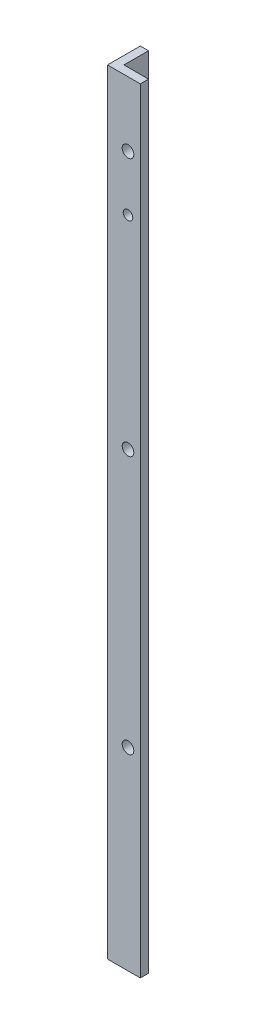
ISO-10303-21;
HEADER;
FILE_DESCRIPTION(('STEP AP214'),'2;1');
FILE_NAME('part.step','',(''),(''),'','','');
FILE_SCHEMA(('AUTOMOTIVE_DESIGN { 1 0 10303 214 1 1 1 1 }'));
ENDSEC;
DATA;
#1=APPLICATION_CONTEXT('core data for automotive mechanical design processes');
#2=APPLICATION_PROTOCOL_DEFINITION('international standard','automotive_design',2000,#1);
#3=PRODUCT_CONTEXT('',#1,'mechanical');
#4=PRODUCT('Part','Part','',(#3));
#5=PRODUCT_RELATED_PRODUCT_CATEGORY('part','',(#4));
#6=PRODUCT_DEFINITION_FORMATION('','',#4);
#7=PRODUCT_DEFINITION_CONTEXT('part definition',#1,'design');
#8=PRODUCT_DEFINITION('design','',#6,#7);
#9=PRODUCT_DEFINITION_SHAPE('','',#8);
#10=(LENGTH_UNIT() NAMED_UNIT(*) SI_UNIT(.MILLI.,.METRE.));
#11=(NAMED_UNIT(*) PLANE_ANGLE_UNIT() SI_UNIT($,.RADIAN.));
#12=(NAMED_UNIT(*) SI_UNIT($,.STERADIAN.) SOLID_ANGLE_UNIT());
#13=UNCERTAINTY_MEASURE_WITH_UNIT(LENGTH_MEASURE(1.E-05),#10,'distance_accuracy_value','');
#14=(GEOMETRIC_REPRESENTATION_CONTEXT(3) GLOBAL_UNCERTAINTY_ASSIGNED_CONTEXT((#13)) GLOBAL_UNIT_ASSIGNED_CONTEXT((#10,
#11,#12)) REPRESENTATION_CONTEXT('',''));
#15=CARTESIAN_POINT('',(0.,0.,0.));
#16=DIRECTION('',(0.,0.,1.));
#17=DIRECTION('',(1.,0.,0.));
#18=AXIS2_PLACEMENT_3D('',#15,#16,#17);
#19=CARTESIAN_POINT('',(0.,300.,0.));
#20=DIRECTION('',(1.,0.,0.));
#21=DIRECTION('',(0.,0.,-1.));
#22=AXIS2_PLACEMENT_3D('',#19,#20,#21);
#23=PLANE('',#22);
#24=CARTESIAN_POINT('',(0.,225.,-7.94000000000001));
#25=DIRECTION('',(1.,0.,0.));
#26=DIRECTION('',(0.,0.,-1.));
#27=AXIS2_PLACEMENT_3D('',#24,#25,#26);
#28=CIRCLE('',#27,2.25);
#29=CARTESIAN_POINT('',(0.,225.,-10.19));
#30=VERTEX_POINT('',#29);
#31=EDGE_CURVE('E175',#30,#30,#28,.T.);
#32=ORIENTED_EDGE('',*,*,#31,.T.);
#33=EDGE_LOOP('',(#32));
#34=FACE_BOUND('',#33,.T.);
#35=CARTESIAN_POINT('',(0.,125.,-7.94000000000001));
#36=DIRECTION('',(1.,0.,0.));
#37=DIRECTION('',(0.,0.,-1.));
#38=AXIS2_PLACEMENT_3D('',#35,#36,#37);
#39=CIRCLE('',#38,2.25);
#40=CARTESIAN_POINT('',(0.,125.,-10.19));
#41=VERTEX_POINT('',#40);
#42=EDGE_CURVE('E179',#41,#41,#39,.T.);
#43=ORIENTED_EDGE('',*,*,#42,.T.);
#44=EDGE_LOOP('',(#43));
#45=FACE_BOUND('',#44,.T.);
#46=CARTESIAN_POINT('',(0.,25.,-7.94000000000001));
#47=DIRECTION('',(1.,0.,0.));
#48=DIRECTION('',(0.,0.,-1.));
#49=AXIS2_PLACEMENT_3D('',#46,#47,#48);
#50=CIRCLE('',#49,2.25);
#51=CARTESIAN_POINT('',(0.,25.,-10.19));
#52=VERTEX_POINT('',#51);
#53=EDGE_CURVE('E182',#52,#52,#50,.T.);
#54=ORIENTED_EDGE('',*,*,#53,.T.);
#55=EDGE_LOOP('',(#54));
#56=FACE_BOUND('',#55,.T.);
#57=DIRECTION('',(0.,0.,1.));
#58=VECTOR('',#57,1.);
#59=CARTESIAN_POINT('',(0.,0.,0.));
#60=LINE('',#59,#58);
#61=CARTESIAN_POINT('',(0.,0.,-12.7));
#62=VERTEX_POINT('',#61);
#63=CARTESIAN_POINT('',(0.,0.,0.));
#64=VERTEX_POINT('',#63);
#65=EDGE_CURVE('E129',#62,#64,#60,.T.);
#66=ORIENTED_EDGE('',*,*,#65,.T.);
#67=DIRECTION('',(0.,-1.,0.));
#68=VECTOR('',#67,1.);
#69=CARTESIAN_POINT('',(0.,300.,0.));
#70=LINE('',#69,#68);
#71=CARTESIAN_POINT('',(0.,300.,0.));
#72=VERTEX_POINT('',#71);
#73=EDGE_CURVE('E11',#72,#64,#70,.T.);
#74=ORIENTED_EDGE('',*,*,#73,.F.);
#75=DIRECTION('',(0.,0.,1.));
#76=VECTOR('',#75,1.);
#77=CARTESIAN_POINT('',(0.,300.,0.));
#78=LINE('',#77,#76);
#79=CARTESIAN_POINT('',(0.,300.,-12.7));
#80=VERTEX_POINT('',#79);
#81=EDGE_CURVE('E140',#80,#72,#78,.T.);
#82=ORIENTED_EDGE('',*,*,#81,.F.);
#83=DIRECTION('',(0.,-1.,0.));
#84=VECTOR('',#83,1.);
#85=CARTESIAN_POINT('',(0.,300.,-12.7));
#86=LINE('',#85,#84);
#87=EDGE_CURVE('E125',#80,#62,#86,.T.);
#88=ORIENTED_EDGE('',*,*,#87,.T.);
#89=EDGE_LOOP('',(#66,#74,#82,#88));
#90=FACE_BOUND('',#89,.T.);
#91=ADVANCED_FACE('F44',(#34,#45,#56,#90),#23,.F.);
#92=CARTESIAN_POINT('',(0.,300.,0.));
#93=DIRECTION('',(0.,0.,-1.));
#94=DIRECTION('',(-1.,0.,0.));
#95=AXIS2_PLACEMENT_3D('',#92,#93,#94);
#96=PLANE('',#95);
#97=CARTESIAN_POINT('',(7.93999999999999,253.6,0.));
#98=DIRECTION('',(0.,0.,1.));
#99=DIRECTION('',(1.,0.,0.));
#100=AXIS2_PLACEMENT_3D('',#97,#98,#99);
#101=CIRCLE('',#100,1.85);
#102=CARTESIAN_POINT('',(9.78999999999999,253.6,0.));
#103=VERTEX_POINT('',#102);
#104=EDGE_CURVE('E370',#103,#103,#101,.T.);
#105=ORIENTED_EDGE('',*,*,#104,.F.);
#106=EDGE_LOOP('',(#105));
#107=FACE_BOUND('',#106,.T.);
#108=CARTESIAN_POINT('',(7.94,275.,0.));
#109=DIRECTION('',(0.,0.,-1.));
#110=DIRECTION('',(-1.,0.,0.));
#111=AXIS2_PLACEMENT_3D('',#108,#109,#110);
#112=CIRCLE('',#111,2.25);
#113=CARTESIAN_POINT('',(5.68999999999999,275.,0.));
#114=VERTEX_POINT('',#113);
#115=EDGE_CURVE('E133',#114,#114,#112,.T.);
#116=ORIENTED_EDGE('',*,*,#115,.T.);
#117=EDGE_LOOP('',(#116));
#118=FACE_BOUND('',#117,.T.);
#119=CARTESIAN_POINT('',(7.94,175.,0.));
#120=DIRECTION('',(0.,0.,-1.));
#121=DIRECTION('',(-1.,0.,0.));
#122=AXIS2_PLACEMENT_3D('',#119,#120,#121);
#123=CIRCLE('',#122,2.25);
#124=CARTESIAN_POINT('',(5.68999999999999,175.,0.));
#125=VERTEX_POINT('',#124);
#126=EDGE_CURVE('E207',#125,#125,#123,.T.);
#127=ORIENTED_EDGE('',*,*,#126,.T.);
#128=EDGE_LOOP('',(#127));
#129=FACE_BOUND('',#128,.T.);
#130=CARTESIAN_POINT('',(7.94,75.,0.));
#131=DIRECTION('',(0.,0.,-1.));
#132=DIRECTION('',(-1.,0.,0.));
#133=AXIS2_PLACEMENT_3D('',#130,#131,#132);
#134=CIRCLE('',#133,2.25);
#135=CARTESIAN_POINT('',(5.68999999999999,75.,0.));
#136=VERTEX_POINT('',#135);
#137=EDGE_CURVE('E199',#136,#136,#134,.T.);
#138=ORIENTED_EDGE('',*,*,#137,.T.);
#139=EDGE_LOOP('',(#138));
#140=FACE_BOUND('',#139,.T.);
#141=DIRECTION('',(1.,0.,0.));
#142=VECTOR('',#141,1.);
#143=CARTESIAN_POINT('',(0.,0.,0.));
#144=LINE('',#143,#142);
#145=CARTESIAN_POINT('',(12.7,0.,0.));
#146=VERTEX_POINT('',#145);
#147=EDGE_CURVE('E132',#64,#146,#144,.T.);
#148=ORIENTED_EDGE('',*,*,#147,.T.);
#149=DIRECTION('',(0.,-1.,0.));
#150=VECTOR('',#149,1.);
#151=CARTESIAN_POINT('',(12.7,300.,0.));
#152=LINE('',#151,#150);
#153=CARTESIAN_POINT('',(12.7,300.,0.));
#154=VERTEX_POINT('',#153);
#155=EDGE_CURVE('E53',#154,#146,#152,.T.);
#156=ORIENTED_EDGE('',*,*,#155,.F.);
#157=DIRECTION('',(1.,0.,0.));
#158=VECTOR('',#157,1.);
#159=CARTESIAN_POINT('',(0.,300.,0.));
#160=LINE('',#159,#158);
#161=EDGE_CURVE('E98',#72,#154,#160,.T.);
#162=ORIENTED_EDGE('',*,*,#161,.F.);
#163=ORIENTED_EDGE('',*,*,#73,.T.);
#164=EDGE_LOOP('',(#148,#156,#162,#163));
#165=FACE_BOUND('',#164,.T.);
#166=ADVANCED_FACE('F166',(#107,#118,#129,#140,#165),#96,.F.);
#167=CARTESIAN_POINT('',(12.7,300.,0.));
#168=DIRECTION('',(-1.,0.,0.));
#169=DIRECTION('',(0.,0.,1.));
#170=AXIS2_PLACEMENT_3D('',#167,#168,#169);
#171=PLANE('',#170);
#172=DIRECTION('',(0.,0.,-1.));
#173=VECTOR('',#172,1.);
#174=CARTESIAN_POINT('',(12.7,0.,0.));
#175=LINE('',#174,#173);
#176=CARTESIAN_POINT('',(12.7,0.,-3.18));
#177=VERTEX_POINT('',#176);
#178=EDGE_CURVE('E135',#146,#177,#175,.T.);
#179=ORIENTED_EDGE('',*,*,#178,.T.);
#180=DIRECTION('',(0.,-1.,0.));
#181=VECTOR('',#180,1.);
#182=CARTESIAN_POINT('',(12.7,300.,-3.18));
#183=LINE('',#182,#181);
#184=CARTESIAN_POINT('',(12.7,300.,-3.18));
#185=VERTEX_POINT('',#184);
#186=EDGE_CURVE('E120',#185,#177,#183,.T.);
#187=ORIENTED_EDGE('',*,*,#186,.F.);
#188=DIRECTION('',(0.,0.,-1.));
#189=VECTOR('',#188,1.);
#190=CARTESIAN_POINT('',(12.7,300.,0.));
#191=LINE('',#190,#189);
#192=EDGE_CURVE('E111',#154,#185,#191,.T.);
#193=ORIENTED_EDGE('',*,*,#192,.F.);
#194=ORIENTED_EDGE('',*,*,#155,.T.);
#195=EDGE_LOOP('',(#179,#187,#193,#194));
#196=FACE_BOUND('',#195,.T.);
#197=ADVANCED_FACE('F147',(#196),#171,.F.);
#198=CARTESIAN_POINT('',(3.18,300.,-3.18));
#199=DIRECTION('',(0.,0.,1.));
#200=DIRECTION('',(1.,0.,0.));
#201=AXIS2_PLACEMENT_3D('',#198,#199,#200);
#202=PLANE('',#201);
#203=CARTESIAN_POINT('',(7.93999999999999,253.6,-3.18));
#204=DIRECTION('',(0.,0.,1.));
#205=DIRECTION('',(1.,0.,0.));
#206=AXIS2_PLACEMENT_3D('',#203,#204,#205);
#207=CIRCLE('',#206,1.85);
#208=CARTESIAN_POINT('',(9.78999999999999,253.6,-3.18));
#209=VERTEX_POINT('',#208);
#210=EDGE_CURVE('E47',#209,#209,#207,.T.);
#211=ORIENTED_EDGE('',*,*,#210,.T.);
#212=EDGE_LOOP('',(#211));
#213=FACE_BOUND('',#212,.T.);
#214=CARTESIAN_POINT('',(7.94,275.,-3.18));
#215=DIRECTION('',(0.,0.,-1.));
#216=DIRECTION('',(-1.,0.,0.));
#217=AXIS2_PLACEMENT_3D('',#214,#215,#216);
#218=CIRCLE('',#217,2.25);
#219=CARTESIAN_POINT('',(5.68999999999999,275.,-3.18));
#220=VERTEX_POINT('',#219);
#221=EDGE_CURVE('E196',#220,#220,#218,.T.);
#222=ORIENTED_EDGE('',*,*,#221,.F.);
#223=EDGE_LOOP('',(#222));
#224=FACE_BOUND('',#223,.T.);
#225=CARTESIAN_POINT('',(7.94,175.,-3.18));
#226=DIRECTION('',(0.,0.,-1.));
#227=DIRECTION('',(-1.,0.,0.));
#228=AXIS2_PLACEMENT_3D('',#225,#226,#227);
#229=CIRCLE('',#228,2.25);
#230=CARTESIAN_POINT('',(5.68999999999999,175.,-3.18));
#231=VERTEX_POINT('',#230);
#232=EDGE_CURVE('E200',#231,#231,#229,.T.);
#233=ORIENTED_EDGE('',*,*,#232,.F.);
#234=EDGE_LOOP('',(#233));
#235=FACE_BOUND('',#234,.T.);
#236=CARTESIAN_POINT('',(7.94,75.,-3.18));
#237=DIRECTION('',(0.,0.,-1.));
#238=DIRECTION('',(-1.,0.,0.));
#239=AXIS2_PLACEMENT_3D('',#236,#237,#238);
#240=CIRCLE('',#239,2.25);
#241=CARTESIAN_POINT('',(5.68999999999999,75.,-3.18));
#242=VERTEX_POINT('',#241);
#243=EDGE_CURVE('E195',#242,#242,#240,.T.);
#244=ORIENTED_EDGE('',*,*,#243,.F.);
#245=EDGE_LOOP('',(#244));
#246=FACE_BOUND('',#245,.T.);
#247=DIRECTION('',(-1.,0.,0.));
#248=VECTOR('',#247,1.);
#249=CARTESIAN_POINT('',(3.18,0.,-3.18));
#250=LINE('',#249,#248);
#251=CARTESIAN_POINT('',(3.18,0.,-3.18));
#252=VERTEX_POINT('',#251);
#253=EDGE_CURVE('E119',#177,#252,#250,.T.);
#254=ORIENTED_EDGE('',*,*,#253,.T.);
#255=DIRECTION('',(0.,-1.,0.));
#256=VECTOR('',#255,1.);
#257=CARTESIAN_POINT('',(3.18,300.,-3.18));
#258=LINE('',#257,#256);
#259=CARTESIAN_POINT('',(3.18,300.,-3.18));
#260=VERTEX_POINT('',#259);
#261=EDGE_CURVE('E116',#260,#252,#258,.T.);
#262=ORIENTED_EDGE('',*,*,#261,.F.);
#263=DIRECTION('',(-1.,0.,0.));
#264=VECTOR('',#263,1.);
#265=CARTESIAN_POINT('',(3.18,300.,-3.18));
#266=LINE('',#265,#264);
#267=EDGE_CURVE('E105',#185,#260,#266,.T.);
#268=ORIENTED_EDGE('',*,*,#267,.F.);
#269=ORIENTED_EDGE('',*,*,#186,.T.);
#270=EDGE_LOOP('',(#254,#262,#268,#269));
#271=FACE_BOUND('',#270,.T.);
#272=ADVANCED_FACE('F117',(#213,#224,#235,#246,#271),#202,.F.);
#273=CARTESIAN_POINT('',(3.18,300.,-3.18));
#274=DIRECTION('',(-1.,0.,0.));
#275=DIRECTION('',(0.,0.,1.));
#276=AXIS2_PLACEMENT_3D('',#273,#274,#275);
#277=PLANE('',#276);
#278=CARTESIAN_POINT('',(3.18,225.,-7.94000000000001));
#279=DIRECTION('',(1.,0.,0.));
#280=DIRECTION('',(0.,0.,-1.));
#281=AXIS2_PLACEMENT_3D('',#278,#279,#280);
#282=CIRCLE('',#281,2.25);
#283=CARTESIAN_POINT('',(3.18,225.,-10.19));
#284=VERTEX_POINT('',#283);
#285=EDGE_CURVE('E184',#284,#284,#282,.T.);
#286=ORIENTED_EDGE('',*,*,#285,.F.);
#287=EDGE_LOOP('',(#286));
#288=FACE_BOUND('',#287,.T.);
#289=CARTESIAN_POINT('',(3.18,125.,-7.94000000000001));
#290=DIRECTION('',(1.,0.,0.));
#291=DIRECTION('',(0.,0.,-1.));
#292=AXIS2_PLACEMENT_3D('',#289,#290,#291);
#293=CIRCLE('',#292,2.25);
#294=CARTESIAN_POINT('',(3.18,125.,-10.19));
#295=VERTEX_POINT('',#294);
#296=EDGE_CURVE('E188',#295,#295,#293,.T.);
#297=ORIENTED_EDGE('',*,*,#296,.F.);
#298=EDGE_LOOP('',(#297));
#299=FACE_BOUND('',#298,.T.);
#300=CARTESIAN_POINT('',(3.18,25.,-7.94000000000001));
#301=DIRECTION('',(1.,0.,0.));
#302=DIRECTION('',(0.,0.,-1.));
#303=AXIS2_PLACEMENT_3D('',#300,#301,#302);
#304=CIRCLE('',#303,2.25);
#305=CARTESIAN_POINT('',(3.18,25.,-10.19));
#306=VERTEX_POINT('',#305);
#307=EDGE_CURVE('E191',#306,#306,#304,.T.);
#308=ORIENTED_EDGE('',*,*,#307,.F.);
#309=EDGE_LOOP('',(#308));
#310=FACE_BOUND('',#309,.T.);
#311=DIRECTION('',(0.,0.,-1.));
#312=VECTOR('',#311,1.);
#313=CARTESIAN_POINT('',(3.18,0.,-3.18));
#314=LINE('',#313,#312);
#315=CARTESIAN_POINT('',(3.18,0.,-12.7));
#316=VERTEX_POINT('',#315);
#317=EDGE_CURVE('E84',#252,#316,#314,.T.);
#318=ORIENTED_EDGE('',*,*,#317,.T.);
#319=DIRECTION('',(0.,-1.,0.));
#320=VECTOR('',#319,1.);
#321=CARTESIAN_POINT('',(3.18,300.,-12.7));
#322=LINE('',#321,#320);
#323=CARTESIAN_POINT('',(3.18,300.,-12.7));
#324=VERTEX_POINT('',#323);
#325=EDGE_CURVE('E121',#324,#316,#322,.T.);
#326=ORIENTED_EDGE('',*,*,#325,.F.);
#327=DIRECTION('',(0.,0.,-1.));
#328=VECTOR('',#327,1.);
#329=CARTESIAN_POINT('',(3.18,300.,-3.18));
#330=LINE('',#329,#328);
#331=EDGE_CURVE('E109',#260,#324,#330,.T.);
#332=ORIENTED_EDGE('',*,*,#331,.F.);
#333=ORIENTED_EDGE('',*,*,#261,.T.);
#334=EDGE_LOOP('',(#318,#326,#332,#333));
#335=FACE_BOUND('',#334,.T.);
#336=ADVANCED_FACE('F123',(#288,#299,#310,#335),#277,.F.);
#337=CARTESIAN_POINT('',(0.,300.,-12.7));
#338=DIRECTION('',(0.,0.,1.));
#339=DIRECTION('',(1.,0.,0.));
#340=AXIS2_PLACEMENT_3D('',#337,#338,#339);
#341=PLANE('',#340);
#342=DIRECTION('',(-1.,0.,0.));
#343=VECTOR('',#342,1.);
#344=CARTESIAN_POINT('',(0.,0.,-12.7));
#345=LINE('',#344,#343);
#346=EDGE_CURVE('E90',#316,#62,#345,.T.);
#347=ORIENTED_EDGE('',*,*,#346,.T.);
#348=ORIENTED_EDGE('',*,*,#87,.F.);
#349=DIRECTION('',(-1.,0.,0.));
#350=VECTOR('',#349,1.);
#351=CARTESIAN_POINT('',(0.,300.,-12.7));
#352=LINE('',#351,#350);
#353=EDGE_CURVE('E61',#324,#80,#352,.T.);
#354=ORIENTED_EDGE('',*,*,#353,.F.);
#355=ORIENTED_EDGE('',*,*,#325,.T.);
#356=EDGE_LOOP('',(#347,#348,#354,#355));
#357=FACE_BOUND('',#356,.T.);
#358=ADVANCED_FACE('F154',(#357),#341,.F.);
#359=CARTESIAN_POINT('',(0.,300.,0.));
#360=DIRECTION('',(0.,-1.,0.));
#361=DIRECTION('',(0.,0.,-1.));
#362=AXIS2_PLACEMENT_3D('',#359,#360,#361);
#363=PLANE('',#362);
#364=ORIENTED_EDGE('',*,*,#81,.T.);
#365=ORIENTED_EDGE('',*,*,#161,.T.);
#366=ORIENTED_EDGE('',*,*,#192,.T.);
#367=ORIENTED_EDGE('',*,*,#267,.T.);
#368=ORIENTED_EDGE('',*,*,#331,.T.);
#369=ORIENTED_EDGE('',*,*,#353,.T.);
#370=EDGE_LOOP('',(#364,#365,#366,#367,#368,#369));
#371=FACE_BOUND('',#370,.T.);
#372=ADVANCED_FACE('F107',(#371),#363,.F.);
#373=CARTESIAN_POINT('',(0.,0.,0.));
#374=DIRECTION('',(0.,-1.,0.));
#375=DIRECTION('',(0.,0.,-1.));
#376=AXIS2_PLACEMENT_3D('',#373,#374,#375);
#377=PLANE('',#376);
#378=ORIENTED_EDGE('',*,*,#65,.F.);
#379=ORIENTED_EDGE('',*,*,#346,.F.);
#380=ORIENTED_EDGE('',*,*,#317,.F.);
#381=ORIENTED_EDGE('',*,*,#253,.F.);
#382=ORIENTED_EDGE('',*,*,#178,.F.);
#383=ORIENTED_EDGE('',*,*,#147,.F.);
#384=EDGE_LOOP('',(#378,#379,#380,#381,#382,#383));
#385=FACE_BOUND('',#384,.T.);
#386=ADVANCED_FACE('F150',(#385),#377,.T.);
#387=CARTESIAN_POINT('',(7.94,75.,296.82));
#388=DIRECTION('',(0.,0.,-1.));
#389=DIRECTION('',(-1.,0.,0.));
#390=AXIS2_PLACEMENT_3D('',#387,#388,#389);
#391=CYLINDRICAL_SURFACE('',#390,2.25);
#392=ORIENTED_EDGE('',*,*,#243,.T.);
#393=EDGE_LOOP('',(#392));
#394=FACE_BOUND('',#393,.T.);
#395=ORIENTED_EDGE('',*,*,#137,.F.);
#396=EDGE_LOOP('',(#395));
#397=FACE_BOUND('',#396,.T.);
#398=ADVANCED_FACE('F230',(#394,#397),#391,.F.);
#399=CARTESIAN_POINT('',(7.94,175.,296.82));
#400=DIRECTION('',(0.,0.,-1.));
#401=DIRECTION('',(-1.,0.,0.));
#402=AXIS2_PLACEMENT_3D('',#399,#400,#401);
#403=CYLINDRICAL_SURFACE('',#402,2.25);
#404=ORIENTED_EDGE('',*,*,#232,.T.);
#405=EDGE_LOOP('',(#404));
#406=FACE_BOUND('',#405,.T.);
#407=ORIENTED_EDGE('',*,*,#126,.F.);
#408=EDGE_LOOP('',(#407));
#409=FACE_BOUND('',#408,.T.);
#410=ADVANCED_FACE('F220',(#406,#409),#403,.F.);
#411=CARTESIAN_POINT('',(7.94,275.,296.82));
#412=DIRECTION('',(0.,0.,-1.));
#413=DIRECTION('',(-1.,0.,0.));
#414=AXIS2_PLACEMENT_3D('',#411,#412,#413);
#415=CYLINDRICAL_SURFACE('',#414,2.25);
#416=ORIENTED_EDGE('',*,*,#221,.T.);
#417=EDGE_LOOP('',(#416));
#418=FACE_BOUND('',#417,.T.);
#419=ORIENTED_EDGE('',*,*,#115,.F.);
#420=EDGE_LOOP('',(#419));
#421=FACE_BOUND('',#420,.T.);
#422=ADVANCED_FACE('F217',(#418,#421),#415,.F.);
#423=CARTESIAN_POINT('',(-6.82,25.,-7.94000000000001));
#424=DIRECTION('',(1.,0.,0.));
#425=DIRECTION('',(0.,0.,-1.));
#426=AXIS2_PLACEMENT_3D('',#423,#424,#425);
#427=CYLINDRICAL_SURFACE('',#426,2.25);
#428=ORIENTED_EDGE('',*,*,#307,.T.);
#429=EDGE_LOOP('',(#428));
#430=FACE_BOUND('',#429,.T.);
#431=ORIENTED_EDGE('',*,*,#53,.F.);
#432=EDGE_LOOP('',(#431));
#433=FACE_BOUND('',#432,.T.);
#434=ADVANCED_FACE('F219',(#430,#433),#427,.F.);
#435=CARTESIAN_POINT('',(-6.82,125.,-7.94000000000001));
#436=DIRECTION('',(1.,0.,0.));
#437=DIRECTION('',(0.,0.,-1.));
#438=AXIS2_PLACEMENT_3D('',#435,#436,#437);
#439=CYLINDRICAL_SURFACE('',#438,2.25);
#440=ORIENTED_EDGE('',*,*,#296,.T.);
#441=EDGE_LOOP('',(#440));
#442=FACE_BOUND('',#441,.T.);
#443=ORIENTED_EDGE('',*,*,#42,.F.);
#444=EDGE_LOOP('',(#443));
#445=FACE_BOUND('',#444,.T.);
#446=ADVANCED_FACE('F227',(#442,#445),#439,.F.);
#447=CARTESIAN_POINT('',(-6.82,225.,-7.94000000000001));
#448=DIRECTION('',(1.,0.,0.));
#449=DIRECTION('',(0.,0.,-1.));
#450=AXIS2_PLACEMENT_3D('',#447,#448,#449);
#451=CYLINDRICAL_SURFACE('',#450,2.25);
#452=ORIENTED_EDGE('',*,*,#285,.T.);
#453=EDGE_LOOP('',(#452));
#454=FACE_BOUND('',#453,.T.);
#455=ORIENTED_EDGE('',*,*,#31,.F.);
#456=EDGE_LOOP('',(#455));
#457=FACE_BOUND('',#456,.T.);
#458=ADVANCED_FACE('F288',(#454,#457),#451,.F.);
#459=CARTESIAN_POINT('',(7.93999999999999,253.6,-12.7));
#460=DIRECTION('',(0.,0.,1.));
#461=DIRECTION('',(1.,0.,0.));
#462=AXIS2_PLACEMENT_3D('',#459,#460,#461);
#463=CYLINDRICAL_SURFACE('',#462,1.85);
#464=ORIENTED_EDGE('',*,*,#104,.T.);
#465=EDGE_LOOP('',(#464));
#466=FACE_BOUND('',#465,.T.);
#467=ORIENTED_EDGE('',*,*,#210,.F.);
#468=EDGE_LOOP('',(#467));
#469=FACE_BOUND('',#468,.T.);
#470=ADVANCED_FACE('F298',(#466,#469),#463,.F.);
#471=CLOSED_SHELL('',(#91,#166,#197,#272,#336,#358,#372,#386,#398,#410,#422,#434,#446,#458,#470));
#472=MANIFOLD_SOLID_BREP('B2',#471);
#473=ADVANCED_BREP_SHAPE_REPRESENTATION('',(#18,#472),#14);
#474=SHAPE_DEFINITION_REPRESENTATION(#9,#473);
ENDSEC;
END-ISO-10303-21;
